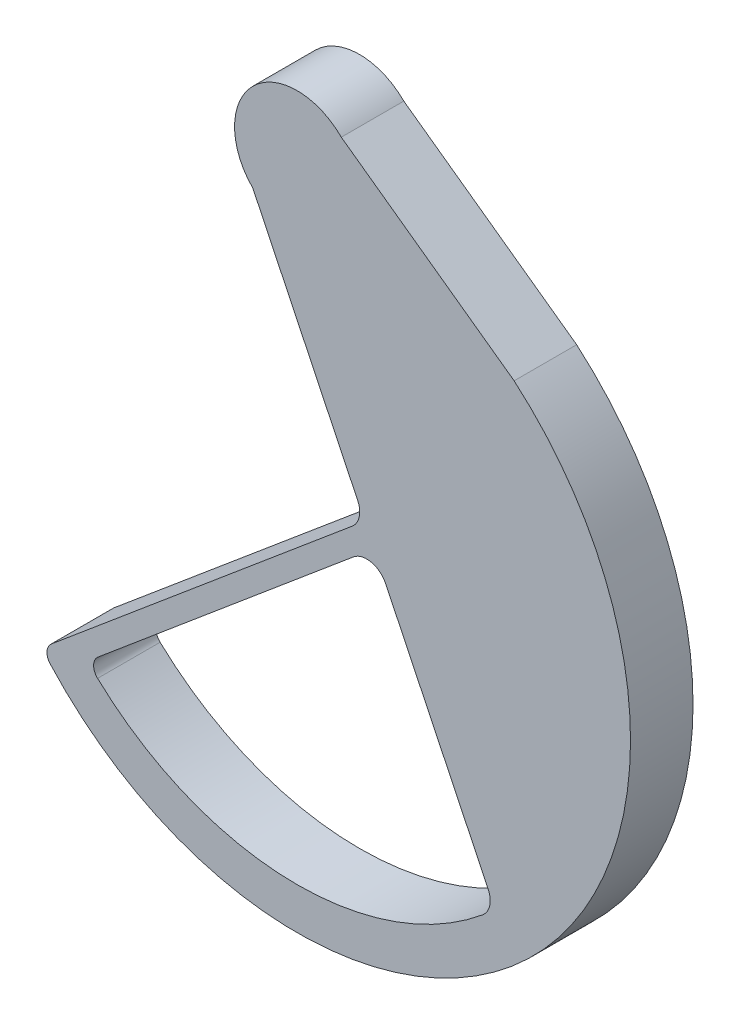
ISO-10303-21;
HEADER;
FILE_DESCRIPTION(('STEP AP214'),'2;1');
FILE_NAME('part.step','',(''),(''),'','','');
FILE_SCHEMA(('AUTOMOTIVE_DESIGN { 1 0 10303 214 1 1 1 1 }'));
ENDSEC;
DATA;
#1=APPLICATION_CONTEXT('core data for automotive mechanical design processes');
#2=APPLICATION_PROTOCOL_DEFINITION('international standard','automotive_design',2000,#1);
#3=PRODUCT_CONTEXT('',#1,'mechanical');
#4=PRODUCT('Part','Part','',(#3));
#5=PRODUCT_RELATED_PRODUCT_CATEGORY('part','',(#4));
#6=PRODUCT_DEFINITION_FORMATION('','',#4);
#7=PRODUCT_DEFINITION_CONTEXT('part definition',#1,'design');
#8=PRODUCT_DEFINITION('design','',#6,#7);
#9=PRODUCT_DEFINITION_SHAPE('','',#8);
#10=(LENGTH_UNIT() NAMED_UNIT(*) SI_UNIT(.MILLI.,.METRE.));
#11=(NAMED_UNIT(*) PLANE_ANGLE_UNIT() SI_UNIT($,.RADIAN.));
#12=(NAMED_UNIT(*) SI_UNIT($,.STERADIAN.) SOLID_ANGLE_UNIT());
#13=UNCERTAINTY_MEASURE_WITH_UNIT(LENGTH_MEASURE(1.E-05),#10,'distance_accuracy_value','');
#14=(GEOMETRIC_REPRESENTATION_CONTEXT(3) GLOBAL_UNCERTAINTY_ASSIGNED_CONTEXT((#13)) GLOBAL_UNIT_ASSIGNED_CONTEXT((#10,
#11,#12)) REPRESENTATION_CONTEXT('',''));
#15=CARTESIAN_POINT('',(0.,0.,0.));
#16=DIRECTION('',(0.,0.,1.));
#17=DIRECTION('',(1.,0.,0.));
#18=AXIS2_PLACEMENT_3D('',#15,#16,#17);
#19=CARTESIAN_POINT('',(-12.7570586950624,-6.1348621133076,15.));
#20=DIRECTION('',(0.901206602628173,0.433389731511241,0.));
#21=DIRECTION('',(-0.433389731511241,0.901206602628173,0.));
#22=AXIS2_PLACEMENT_3D('',#19,#20,#21);
#23=PLANE('',#22);
#24=DIRECTION('',(0.433389731511241,-0.901206602628173,0.));
#25=VECTOR('',#24,1.);
#26=CARTESIAN_POINT('',(-12.7570586950624,-6.1348621133076,0.));
#27=LINE('',#26,#25);
#28=CARTESIAN_POINT('',(21.2324006956412,-76.8137984043253,0.));
#29=VERTEX_POINT('',#28);
#30=CARTESIAN_POINT('',(45.844843506453,-127.9938203457,0.));
#31=VERTEX_POINT('',#30);
#32=EDGE_CURVE('E185',#29,#31,#27,.T.);
#33=ORIENTED_EDGE('',*,*,#32,.T.);
#34=DIRECTION('',(0.,0.,-1.));
#35=VECTOR('',#34,1.);
#36=CARTESIAN_POINT('',(45.844843506453,-127.9938203457,15.));
#37=LINE('',#36,#35);
#38=CARTESIAN_POINT('',(45.844843506453,-127.9938203457,15.));
#39=VERTEX_POINT('',#38);
#40=EDGE_CURVE('E11',#39,#31,#37,.T.);
#41=ORIENTED_EDGE('',*,*,#40,.F.);
#42=DIRECTION('',(0.433389731511241,-0.901206602628173,0.));
#43=VECTOR('',#42,1.);
#44=CARTESIAN_POINT('',(-12.7570586950624,-6.1348621133076,15.));
#45=LINE('',#44,#43);
#46=CARTESIAN_POINT('',(21.2324006956412,-76.8137984043253,15.));
#47=VERTEX_POINT('',#46);
#48=EDGE_CURVE('E250',#47,#39,#45,.T.);
#49=ORIENTED_EDGE('',*,*,#48,.F.);
#50=DIRECTION('',(0.,0.,-1.));
#51=VECTOR('',#50,1.);
#52=CARTESIAN_POINT('',(21.2324006956412,-76.8137984043253,15.));
#53=LINE('',#52,#51);
#54=EDGE_CURVE('E198',#47,#29,#53,.T.);
#55=ORIENTED_EDGE('',*,*,#54,.T.);
#56=EDGE_LOOP('',(#33,#41,#49,#55));
#57=FACE_BOUND('',#56,.T.);
#58=ADVANCED_FACE('F35',(#57),#23,.F.);
#59=CARTESIAN_POINT('',(41.3388104933121,-130.160769003256,15.));
#60=DIRECTION('',(0.,0.,-1.));
#61=DIRECTION('',(-1.,0.,0.));
#62=AXIS2_PLACEMENT_3D('',#59,#60,#61);
#63=CYLINDRICAL_SURFACE('',#62,4.99999999999999);
#64=CARTESIAN_POINT('',(41.3388104933121,-130.160769003256,0.));
#65=DIRECTION('',(0.,0.,1.));
#66=DIRECTION('',(1.,0.,0.));
#67=AXIS2_PLACEMENT_3D('',#64,#65,#66);
#68=CIRCLE('',#67,4.99999999999999);
#69=CARTESIAN_POINT('',(44.5187189927976,-134.019289695814,0.));
#70=VERTEX_POINT('',#69);
#71=EDGE_CURVE('E188',#31,#70,#68,.F.);
#72=ORIENTED_EDGE('',*,*,#71,.T.);
#73=DIRECTION('',(0.,0.,-1.));
#74=VECTOR('',#73,1.);
#75=CARTESIAN_POINT('',(44.5187189927976,-134.019289695814,15.));
#76=LINE('',#75,#74);
#77=CARTESIAN_POINT('',(44.5187189927976,-134.019289695814,15.));
#78=VERTEX_POINT('',#77);
#79=EDGE_CURVE('E45',#78,#70,#76,.T.);
#80=ORIENTED_EDGE('',*,*,#79,.F.);
#81=CARTESIAN_POINT('',(41.3388104933121,-130.160769003256,15.));
#82=DIRECTION('',(0.,0.,1.));
#83=DIRECTION('',(1.,0.,0.));
#84=AXIS2_PLACEMENT_3D('',#81,#82,#83);
#85=CIRCLE('',#84,4.99999999999999);
#86=EDGE_CURVE('E252',#39,#78,#85,.F.);
#87=ORIENTED_EDGE('',*,*,#86,.F.);
#88=ORIENTED_EDGE('',*,*,#40,.T.);
#89=EDGE_LOOP('',(#72,#80,#87,#88));
#90=FACE_BOUND('',#89,.T.);
#91=ADVANCED_FACE('F276',(#90),#63,.F.);
#92=CARTESIAN_POINT('',(0.,-80.,15.));
#93=DIRECTION('',(0.,0.,-1.));
#94=DIRECTION('',(-1.,0.,0.));
#95=AXIS2_PLACEMENT_3D('',#92,#93,#94);
#96=CYLINDRICAL_SURFACE('',#95,70.);
#97=CARTESIAN_POINT('',(0.,-80.,0.));
#98=DIRECTION('',(0.,0.,1.));
#99=DIRECTION('',(1.,0.,0.));
#100=AXIS2_PLACEMENT_3D('',#97,#98,#99);
#101=CIRCLE('',#100,70.);
#102=CARTESIAN_POINT('',(-47.870174388264,-131.072951785042,0.));
#103=VERTEX_POINT('',#102);
#104=EDGE_CURVE('E191',#103,#70,#101,.T.);
#105=ORIENTED_EDGE('',*,*,#104,.F.);
#106=DIRECTION('',(0.,0.,-1.));
#107=VECTOR('',#106,1.);
#108=CARTESIAN_POINT('',(-47.870174388264,-131.072951785042,15.));
#109=LINE('',#108,#107);
#110=CARTESIAN_POINT('',(-47.870174388264,-131.072951785042,15.));
#111=VERTEX_POINT('',#110);
#112=EDGE_CURVE('E155',#111,#103,#109,.T.);
#113=ORIENTED_EDGE('',*,*,#112,.F.);
#114=CARTESIAN_POINT('',(0.,-80.,15.));
#115=DIRECTION('',(0.,0.,1.));
#116=DIRECTION('',(1.,0.,0.));
#117=AXIS2_PLACEMENT_3D('',#114,#115,#116);
#118=CIRCLE('',#117,70.);
#119=EDGE_CURVE('E148',#111,#78,#118,.T.);
#120=ORIENTED_EDGE('',*,*,#119,.T.);
#121=ORIENTED_EDGE('',*,*,#79,.T.);
#122=EDGE_LOOP('',(#105,#113,#120,#121));
#123=FACE_BOUND('',#122,.T.);
#124=ADVANCED_FACE('F255',(#123),#96,.F.);
#125=CARTESIAN_POINT('',(-45.8185954859101,-128.884110994254,15.));
#126=DIRECTION('',(0.,0.,-1.));
#127=DIRECTION('',(-1.,0.,0.));
#128=AXIS2_PLACEMENT_3D('',#125,#126,#127);
#129=CYLINDRICAL_SURFACE('',#128,2.99999999999979);
#130=CARTESIAN_POINT('',(-45.8185954859101,-128.884110994254,0.));
#131=DIRECTION('',(0.,0.,1.));
#132=DIRECTION('',(1.,0.,0.));
#133=AXIS2_PLACEMENT_3D('',#130,#131,#132);
#134=CIRCLE('',#133,2.99999999999979);
#135=CARTESIAN_POINT('',(-47.7476784165524,-126.586582094174,0.));
#136=VERTEX_POINT('',#135);
#137=EDGE_CURVE('E154',#103,#136,#134,.F.);
#138=ORIENTED_EDGE('',*,*,#137,.T.);
#139=DIRECTION('',(0.,0.,-1.));
#140=VECTOR('',#139,1.);
#141=CARTESIAN_POINT('',(-47.7476784165524,-126.586582094174,15.));
#142=LINE('',#141,#140);
#143=CARTESIAN_POINT('',(-47.7476784165524,-126.586582094174,15.));
#144=VERTEX_POINT('',#143);
#145=EDGE_CURVE('E151',#144,#136,#142,.T.);
#146=ORIENTED_EDGE('',*,*,#145,.F.);
#147=CARTESIAN_POINT('',(-45.8185954859101,-128.884110994254,15.));
#148=DIRECTION('',(0.,0.,1.));
#149=DIRECTION('',(1.,0.,0.));
#150=AXIS2_PLACEMENT_3D('',#147,#148,#149);
#151=CIRCLE('',#150,2.99999999999979);
#152=EDGE_CURVE('E142',#111,#144,#151,.F.);
#153=ORIENTED_EDGE('',*,*,#152,.F.);
#154=ORIENTED_EDGE('',*,*,#112,.T.);
#155=EDGE_LOOP('',(#138,#146,#153,#154));
#156=FACE_BOUND('',#155,.T.);
#157=ADVANCED_FACE('F152',(#156),#129,.F.);
#158=CARTESIAN_POINT('',(42.5956727933285,-50.7312504333006,15.));
#159=DIRECTION('',(-0.643027643547508,0.765842966693394,0.));
#160=DIRECTION('',(-0.765842966693394,-0.643027643547508,0.));
#161=AXIS2_PLACEMENT_3D('',#158,#159,#160);
#162=PLANE('',#161);
#163=DIRECTION('',(0.765842966693394,0.643027643547508,0.));
#164=VECTOR('',#163,1.);
#165=CARTESIAN_POINT('',(42.5956727933285,-50.7312504333006,0.));
#166=LINE('',#165,#164);
#167=CARTESIAN_POINT('',(13.5112294647628,-75.1515322284145,0.));
#168=VERTEX_POINT('',#167);
#169=EDGE_CURVE('E98',#136,#168,#166,.T.);
#170=ORIENTED_EDGE('',*,*,#169,.T.);
#171=DIRECTION('',(0.,0.,-1.));
#172=VECTOR('',#171,1.);
#173=CARTESIAN_POINT('',(13.5112294647628,-75.1515322284145,15.));
#174=LINE('',#173,#172);
#175=CARTESIAN_POINT('',(13.5112294647628,-75.1515322284145,15.));
#176=VERTEX_POINT('',#175);
#177=EDGE_CURVE('E156',#176,#168,#174,.T.);
#178=ORIENTED_EDGE('',*,*,#177,.F.);
#179=DIRECTION('',(0.765842966693394,0.643027643547508,0.));
#180=VECTOR('',#179,1.);
#181=CARTESIAN_POINT('',(42.5956727933285,-50.7312504333006,15.));
#182=LINE('',#181,#180);
#183=EDGE_CURVE('E146',#144,#176,#182,.T.);
#184=ORIENTED_EDGE('',*,*,#183,.F.);
#185=ORIENTED_EDGE('',*,*,#145,.T.);
#186=EDGE_LOOP('',(#170,#178,#184,#185));
#187=FACE_BOUND('',#186,.T.);
#188=ADVANCED_FACE('F158',(#187),#162,.F.);
#189=CARTESIAN_POINT('',(10.0302471408598,-65.0565868768263,15.));
#190=DIRECTION('',(0.,0.,-1.));
#191=DIRECTION('',(-1.,0.,0.));
#192=AXIS2_PLACEMENT_3D('',#189,#190,#191);
#193=CYLINDRICAL_SURFACE('',#192,5.);
#194=CARTESIAN_POINT('',(10.0302471408598,-65.0565868768263,0.));
#195=DIRECTION('',(0.,0.,1.));
#196=DIRECTION('',(1.,0.,0.));
#197=AXIS2_PLACEMENT_3D('',#194,#195,#196);
#198=CIRCLE('',#197,5.);
#199=CARTESIAN_POINT('',(13.2441851892925,-68.8868090924212,0.));
#200=VERTEX_POINT('',#199);
#201=CARTESIAN_POINT('',(14.5362801540007,-62.8896382192701,0.));
#202=VERTEX_POINT('',#201);
#203=EDGE_CURVE('E164',#200,#202,#198,.T.);
#204=ORIENTED_EDGE('',*,*,#203,.F.);
#205=DIRECTION('',(0.,0.,-1.));
#206=VECTOR('',#205,1.);
#207=CARTESIAN_POINT('',(13.2441851892925,-68.8868090924212,15.));
#208=LINE('',#207,#206);
#209=CARTESIAN_POINT('',(13.2441851892925,-68.8868090924212,15.));
#210=VERTEX_POINT('',#209);
#211=EDGE_CURVE('E39',#210,#200,#208,.T.);
#212=ORIENTED_EDGE('',*,*,#211,.F.);
#213=CARTESIAN_POINT('',(10.0302471408598,-65.0565868768263,15.));
#214=DIRECTION('',(0.,0.,1.));
#215=DIRECTION('',(1.,0.,0.));
#216=AXIS2_PLACEMENT_3D('',#213,#214,#215);
#217=CIRCLE('',#216,5.);
#218=CARTESIAN_POINT('',(14.5362801540007,-62.8896382192701,15.));
#219=VERTEX_POINT('',#218);
#220=EDGE_CURVE('E197',#210,#219,#217,.T.);
#221=ORIENTED_EDGE('',*,*,#220,.T.);
#222=DIRECTION('',(0.,0.,-1.));
#223=VECTOR('',#222,1.);
#224=CARTESIAN_POINT('',(14.5362801540007,-62.8896382192701,15.));
#225=LINE('',#224,#223);
#226=EDGE_CURVE('E160',#219,#202,#225,.T.);
#227=ORIENTED_EDGE('',*,*,#226,.T.);
#228=EDGE_LOOP('',(#204,#212,#221,#227));
#229=FACE_BOUND('',#228,.T.);
#230=ADVANCED_FACE('F37',(#229),#193,.F.);
#231=CARTESIAN_POINT('',(39.3923101204882,-46.9459271066778,15.));
#232=DIRECTION('',(-0.642787609686534,0.766044443118983,0.));
#233=DIRECTION('',(-0.766044443118982,-0.642787609686534,0.));
#234=AXIS2_PLACEMENT_3D('',#231,#232,#233);
#235=PLANE('',#234);
#236=DIRECTION('',(0.766044443118982,0.642787609686534,0.));
#237=VECTOR('',#236,1.);
#238=CARTESIAN_POINT('',(39.3923101204882,-46.9459271066778,0.));
#239=LINE('',#238,#237);
#240=CARTESIAN_POINT('',(-58.9406362868111,-129.457066169617,0.));
#241=VERTEX_POINT('',#240);
#242=EDGE_CURVE('E167',#241,#200,#239,.T.);
#243=ORIENTED_EDGE('',*,*,#242,.F.);
#244=DIRECTION('',(0.,0.,-1.));
#245=VECTOR('',#244,1.);
#246=CARTESIAN_POINT('',(-58.9406362868111,-129.457066169617,15.));
#247=LINE('',#246,#245);
#248=CARTESIAN_POINT('',(-58.9406362868111,-129.457066169617,15.));
#249=VERTEX_POINT('',#248);
#250=EDGE_CURVE('E212',#249,#241,#247,.T.);
#251=ORIENTED_EDGE('',*,*,#250,.F.);
#252=DIRECTION('',(0.766044443118982,0.642787609686534,0.));
#253=VECTOR('',#252,1.);
#254=CARTESIAN_POINT('',(39.3923101204882,-46.9459271066778,15.));
#255=LINE('',#254,#253);
#256=EDGE_CURVE('E221',#249,#210,#255,.T.);
#257=ORIENTED_EDGE('',*,*,#256,.T.);
#258=ORIENTED_EDGE('',*,*,#211,.T.);
#259=EDGE_LOOP('',(#243,#251,#257,#258));
#260=FACE_BOUND('',#259,.T.);
#261=ADVANCED_FACE('F219',(#260),#235,.T.);
#262=CARTESIAN_POINT('',(-57.0122734577518,-131.755199498973,15.));
#263=DIRECTION('',(0.,0.,-1.));
#264=DIRECTION('',(-1.,0.,0.));
#265=AXIS2_PLACEMENT_3D('',#262,#263,#264);
#266=CYLINDRICAL_SURFACE('',#265,2.99999999999976);
#267=CARTESIAN_POINT('',(-57.0122734577518,-131.755199498973,0.));
#268=DIRECTION('',(0.,0.,1.));
#269=DIRECTION('',(1.,0.,0.));
#270=AXIS2_PLACEMENT_3D('',#267,#268,#269);
#271=CIRCLE('',#270,2.99999999999976);
#272=CARTESIAN_POINT('',(-59.2335308651964,-133.771635843089,0.));
#273=VERTEX_POINT('',#272);
#274=EDGE_CURVE('E171',#273,#241,#271,.F.);
#275=ORIENTED_EDGE('',*,*,#274,.F.);
#276=DIRECTION('',(0.,0.,-1.));
#277=VECTOR('',#276,1.);
#278=CARTESIAN_POINT('',(-59.2335308651964,-133.771635843089,15.));
#279=LINE('',#278,#277);
#280=CARTESIAN_POINT('',(-59.2335308651964,-133.771635843089,15.));
#281=VERTEX_POINT('',#280);
#282=EDGE_CURVE('E211',#281,#273,#279,.T.);
#283=ORIENTED_EDGE('',*,*,#282,.F.);
#284=CARTESIAN_POINT('',(-57.0122734577518,-131.755199498973,15.));
#285=DIRECTION('',(0.,0.,1.));
#286=DIRECTION('',(1.,0.,0.));
#287=AXIS2_PLACEMENT_3D('',#284,#285,#286);
#288=CIRCLE('',#287,2.99999999999976);
#289=EDGE_CURVE('E231',#281,#249,#288,.F.);
#290=ORIENTED_EDGE('',*,*,#289,.T.);
#291=ORIENTED_EDGE('',*,*,#250,.T.);
#292=EDGE_LOOP('',(#275,#283,#290,#291));
#293=FACE_BOUND('',#292,.T.);
#294=ADVANCED_FACE('F228',(#293),#266,.T.);
#295=CARTESIAN_POINT('',(0.,-80.,15.));
#296=DIRECTION('',(0.,0.,-1.));
#297=DIRECTION('',(-1.,0.,0.));
#298=AXIS2_PLACEMENT_3D('',#295,#296,#297);
#299=CYLINDRICAL_SURFACE('',#298,80.);
#300=CARTESIAN_POINT('',(0.,-80.,0.));
#301=DIRECTION('',(0.,0.,1.));
#302=DIRECTION('',(1.,0.,0.));
#303=AXIS2_PLACEMENT_3D('',#300,#301,#302);
#304=CIRCLE('',#303,80.);
#305=CARTESIAN_POINT('',(52.0761789176771,-19.2705047828151,0.));
#306=VERTEX_POINT('',#305);
#307=EDGE_CURVE('E174',#273,#306,#304,.T.);
#308=ORIENTED_EDGE('',*,*,#307,.T.);
#309=DIRECTION('',(0.,0.,-1.));
#310=VECTOR('',#309,1.);
#311=CARTESIAN_POINT('',(52.0761789176771,-19.2705047828151,15.));
#312=LINE('',#311,#310);
#313=CARTESIAN_POINT('',(52.0761789176771,-19.2705047828151,15.));
#314=VERTEX_POINT('',#313);
#315=EDGE_CURVE('E209',#314,#306,#312,.T.);
#316=ORIENTED_EDGE('',*,*,#315,.F.);
#317=CARTESIAN_POINT('',(0.,-80.,15.));
#318=DIRECTION('',(0.,0.,1.));
#319=DIRECTION('',(1.,0.,0.));
#320=AXIS2_PLACEMENT_3D('',#317,#318,#319);
#321=CIRCLE('',#320,80.);
#322=EDGE_CURVE('E234',#281,#314,#321,.T.);
#323=ORIENTED_EDGE('',*,*,#322,.F.);
#324=ORIENTED_EDGE('',*,*,#282,.T.);
#325=EDGE_LOOP('',(#308,#316,#323,#324));
#326=FACE_BOUND('',#325,.T.);
#327=ADVANCED_FACE('F235',(#326),#299,.T.);
#328=CARTESIAN_POINT('',(8.65474635415258,12.0128323695447,15.));
#329=DIRECTION('',(0.584549661802916,0.811357931424902,0.));
#330=DIRECTION('',(-0.811357931424902,0.584549661802916,0.));
#331=AXIS2_PLACEMENT_3D('',#328,#329,#330);
#332=PLANE('',#331);
#333=DIRECTION('',(0.811357931424902,-0.584549661802916,0.));
#334=VECTOR('',#333,1.);
#335=CARTESIAN_POINT('',(8.65474635415258,12.0128323695447,0.));
#336=LINE('',#335,#334);
#337=CARTESIAN_POINT('',(10.6066017177981,10.6066017177983,0.));
#338=VERTEX_POINT('',#337);
#339=EDGE_CURVE('E177',#338,#306,#336,.T.);
#340=ORIENTED_EDGE('',*,*,#339,.F.);
#341=DIRECTION('',(0.,0.,-1.));
#342=VECTOR('',#341,1.);
#343=CARTESIAN_POINT('',(10.6066017177981,10.6066017177983,15.));
#344=LINE('',#343,#342);
#345=CARTESIAN_POINT('',(10.6066017177981,10.6066017177983,15.));
#346=VERTEX_POINT('',#345);
#347=EDGE_CURVE('E207',#346,#338,#344,.T.);
#348=ORIENTED_EDGE('',*,*,#347,.F.);
#349=DIRECTION('',(0.811357931424902,-0.584549661802916,0.));
#350=VECTOR('',#349,1.);
#351=CARTESIAN_POINT('',(8.65474635415258,12.0128323695447,15.));
#352=LINE('',#351,#350);
#353=EDGE_CURVE('E239',#346,#314,#352,.T.);
#354=ORIENTED_EDGE('',*,*,#353,.T.);
#355=ORIENTED_EDGE('',*,*,#315,.T.);
#356=EDGE_LOOP('',(#340,#348,#354,#355));
#357=FACE_BOUND('',#356,.T.);
#358=ADVANCED_FACE('F287',(#357),#332,.T.);
#359=CARTESIAN_POINT('',(0.,0.,15.));
#360=DIRECTION('',(0.,0.,-1.));
#361=DIRECTION('',(-1.,0.,0.));
#362=AXIS2_PLACEMENT_3D('',#359,#360,#361);
#363=CYLINDRICAL_SURFACE('',#362,15.);
#364=CARTESIAN_POINT('',(0.,0.,0.));
#365=DIRECTION('',(0.,0.,1.));
#366=DIRECTION('',(1.,0.,0.));
#367=AXIS2_PLACEMENT_3D('',#364,#365,#366);
#368=CIRCLE('',#367,15.);
#369=CARTESIAN_POINT('',(-10.6066017177981,-10.6066017177983,0.));
#370=VERTEX_POINT('',#369);
#371=EDGE_CURVE('E180',#338,#370,#368,.T.);
#372=ORIENTED_EDGE('',*,*,#371,.T.);
#373=DIRECTION('',(0.,0.,-1.));
#374=VECTOR('',#373,1.);
#375=CARTESIAN_POINT('',(-10.6066017177981,-10.6066017177983,15.));
#376=LINE('',#375,#374);
#377=CARTESIAN_POINT('',(-10.6066017177981,-10.6066017177983,15.));
#378=VERTEX_POINT('',#377);
#379=EDGE_CURVE('E204',#378,#370,#376,.T.);
#380=ORIENTED_EDGE('',*,*,#379,.F.);
#381=CARTESIAN_POINT('',(0.,0.,15.));
#382=DIRECTION('',(0.,0.,1.));
#383=DIRECTION('',(1.,0.,0.));
#384=AXIS2_PLACEMENT_3D('',#381,#382,#383);
#385=CIRCLE('',#384,15.);
#386=EDGE_CURVE('E246',#346,#378,#385,.T.);
#387=ORIENTED_EDGE('',*,*,#386,.F.);
#388=ORIENTED_EDGE('',*,*,#347,.T.);
#389=EDGE_LOOP('',(#372,#380,#387,#388));
#390=FACE_BOUND('',#389,.T.);
#391=ADVANCED_FACE('F270',(#390),#363,.T.);
#392=CARTESIAN_POINT('',(-12.7570586950624,-6.13486211330761,15.));
#393=DIRECTION('',(0.901206602628173,0.433389731511242,0.));
#394=DIRECTION('',(-0.433389731511242,0.901206602628173,0.));
#395=AXIS2_PLACEMENT_3D('',#392,#393,#394);
#396=PLANE('',#395);
#397=DIRECTION('',(0.433389731511242,-0.901206602628173,0.));
#398=VECTOR('',#397,1.);
#399=CARTESIAN_POINT('',(-12.7570586950624,-6.13486211330761,0.));
#400=LINE('',#399,#398);
#401=EDGE_CURVE('E182',#370,#202,#400,.T.);
#402=ORIENTED_EDGE('',*,*,#401,.T.);
#403=ORIENTED_EDGE('',*,*,#226,.F.);
#404=DIRECTION('',(0.433389731511242,-0.901206602628173,0.));
#405=VECTOR('',#404,1.);
#406=CARTESIAN_POINT('',(-12.7570586950624,-6.13486211330761,15.));
#407=LINE('',#406,#405);
#408=EDGE_CURVE('E248',#378,#219,#407,.T.);
#409=ORIENTED_EDGE('',*,*,#408,.F.);
#410=ORIENTED_EDGE('',*,*,#379,.T.);
#411=EDGE_LOOP('',(#402,#403,#409,#410));
#412=FACE_BOUND('',#411,.T.);
#413=ADVANCED_FACE('F263',(#412),#396,.F.);
#414=CARTESIAN_POINT('',(16.7263676825004,-78.9807470618814,15.));
#415=DIRECTION('',(0.,0.,-1.));
#416=DIRECTION('',(-1.,0.,0.));
#417=AXIS2_PLACEMENT_3D('',#414,#415,#416);
#418=CYLINDRICAL_SURFACE('',#417,5.);
#419=CARTESIAN_POINT('',(16.7263676825004,-78.9807470618814,0.));
#420=DIRECTION('',(0.,0.,1.));
#421=DIRECTION('',(1.,0.,0.));
#422=AXIS2_PLACEMENT_3D('',#419,#420,#421);
#423=CIRCLE('',#422,5.);
#424=EDGE_CURVE('E104',#168,#29,#423,.F.);
#425=ORIENTED_EDGE('',*,*,#424,.T.);
#426=ORIENTED_EDGE('',*,*,#54,.F.);
#427=CARTESIAN_POINT('',(16.7263676825004,-78.9807470618814,15.));
#428=DIRECTION('',(0.,0.,1.));
#429=DIRECTION('',(1.,0.,0.));
#430=AXIS2_PLACEMENT_3D('',#427,#428,#429);
#431=CIRCLE('',#430,5.);
#432=EDGE_CURVE('E54',#176,#47,#431,.F.);
#433=ORIENTED_EDGE('',*,*,#432,.F.);
#434=ORIENTED_EDGE('',*,*,#177,.T.);
#435=EDGE_LOOP('',(#425,#426,#433,#434));
#436=FACE_BOUND('',#435,.T.);
#437=ADVANCED_FACE('F261',(#436),#418,.F.);
#438=CARTESIAN_POINT('',(0.,0.,15.));
#439=DIRECTION('',(0.,0.,1.));
#440=DIRECTION('',(1.,0.,0.));
#441=AXIS2_PLACEMENT_3D('',#438,#439,#440);
#442=PLANE('',#441);
#443=ORIENTED_EDGE('',*,*,#220,.F.);
#444=ORIENTED_EDGE('',*,*,#256,.F.);
#445=ORIENTED_EDGE('',*,*,#289,.F.);
#446=ORIENTED_EDGE('',*,*,#322,.T.);
#447=ORIENTED_EDGE('',*,*,#353,.F.);
#448=ORIENTED_EDGE('',*,*,#386,.T.);
#449=ORIENTED_EDGE('',*,*,#408,.T.);
#450=EDGE_LOOP('',(#443,#444,#445,#446,#447,#448,#449));
#451=FACE_BOUND('',#450,.T.);
#452=ORIENTED_EDGE('',*,*,#48,.T.);
#453=ORIENTED_EDGE('',*,*,#86,.T.);
#454=ORIENTED_EDGE('',*,*,#119,.F.);
#455=ORIENTED_EDGE('',*,*,#152,.T.);
#456=ORIENTED_EDGE('',*,*,#183,.T.);
#457=ORIENTED_EDGE('',*,*,#432,.T.);
#458=EDGE_LOOP('',(#452,#453,#454,#455,#456,#457));
#459=FACE_BOUND('',#458,.T.);
#460=ADVANCED_FACE('F144',(#451,#459),#442,.T.);
#461=CARTESIAN_POINT('',(0.,0.,0.));
#462=DIRECTION('',(0.,0.,1.));
#463=DIRECTION('',(1.,0.,0.));
#464=AXIS2_PLACEMENT_3D('',#461,#462,#463);
#465=PLANE('',#464);
#466=CARTESIAN_POINT('',(0.,0.,0.));
#467=DIRECTION('',(0.,0.,-1.));
#468=DIRECTION('',(-1.,0.,0.));
#469=AXIS2_PLACEMENT_3D('',#466,#467,#468);
#470=CIRCLE('',#469,10.);
#471=CARTESIAN_POINT('',(-10.,0.,0.));
#472=VERTEX_POINT('',#471);
#473=EDGE_CURVE('E402',#472,#472,#470,.T.);
#474=ORIENTED_EDGE('',*,*,#473,.F.);
#475=EDGE_LOOP('',(#474));
#476=FACE_BOUND('',#475,.T.);
#477=ORIENTED_EDGE('',*,*,#203,.T.);
#478=ORIENTED_EDGE('',*,*,#401,.F.);
#479=ORIENTED_EDGE('',*,*,#371,.F.);
#480=ORIENTED_EDGE('',*,*,#339,.T.);
#481=ORIENTED_EDGE('',*,*,#307,.F.);
#482=ORIENTED_EDGE('',*,*,#274,.T.);
#483=ORIENTED_EDGE('',*,*,#242,.T.);
#484=EDGE_LOOP('',(#477,#478,#479,#480,#481,#482,#483));
#485=FACE_BOUND('',#484,.T.);
#486=ORIENTED_EDGE('',*,*,#32,.F.);
#487=ORIENTED_EDGE('',*,*,#424,.F.);
#488=ORIENTED_EDGE('',*,*,#169,.F.);
#489=ORIENTED_EDGE('',*,*,#137,.F.);
#490=ORIENTED_EDGE('',*,*,#104,.T.);
#491=ORIENTED_EDGE('',*,*,#71,.F.);
#492=EDGE_LOOP('',(#486,#487,#488,#489,#490,#491));
#493=FACE_BOUND('',#492,.T.);
#494=ADVANCED_FACE('F225',(#476,#485,#493),#465,.F.);
#495=CARTESIAN_POINT('',(0.,0.,2.));
#496=DIRECTION('',(0.,0.,-1.));
#497=DIRECTION('',(-1.,0.,0.));
#498=AXIS2_PLACEMENT_3D('',#495,#496,#497);
#499=CYLINDRICAL_SURFACE('',#498,10.);
#500=CARTESIAN_POINT('',(0.,0.,2.));
#501=DIRECTION('',(0.,0.,-1.));
#502=DIRECTION('',(-1.,0.,0.));
#503=AXIS2_PLACEMENT_3D('',#500,#501,#502);
#504=CIRCLE('',#503,10.);
#505=CARTESIAN_POINT('',(-10.,0.,2.));
#506=VERTEX_POINT('',#505);
#507=EDGE_CURVE('E168',#506,#506,#504,.T.);
#508=ORIENTED_EDGE('',*,*,#507,.F.);
#509=EDGE_LOOP('',(#508));
#510=FACE_BOUND('',#509,.T.);
#511=ORIENTED_EDGE('',*,*,#473,.T.);
#512=EDGE_LOOP('',(#511));
#513=FACE_BOUND('',#512,.T.);
#514=ADVANCED_FACE('F377',(#510,#513),#499,.F.);
#515=CARTESIAN_POINT('',(0.,0.,2.));
#516=DIRECTION('',(0.,0.,-1.));
#517=DIRECTION('',(-1.,0.,0.));
#518=AXIS2_PLACEMENT_3D('',#515,#516,#517);
#519=PLANE('',#518);
#520=ORIENTED_EDGE('',*,*,#507,.T.);
#521=EDGE_LOOP('',(#520));
#522=FACE_BOUND('',#521,.T.);
#523=ADVANCED_FACE('F386',(#522),#519,.T.);
#524=CLOSED_SHELL('',(#58,#91,#124,#157,#188,#230,#261,#294,#327,#358,#391,#413,#437,#460,#494,
#514,#523));
#525=MANIFOLD_SOLID_BREP('B2',#524);
#526=ADVANCED_BREP_SHAPE_REPRESENTATION('',(#18,#525),#14);
#527=SHAPE_DEFINITION_REPRESENTATION(#9,#526);
ENDSEC;
END-ISO-10303-21;
